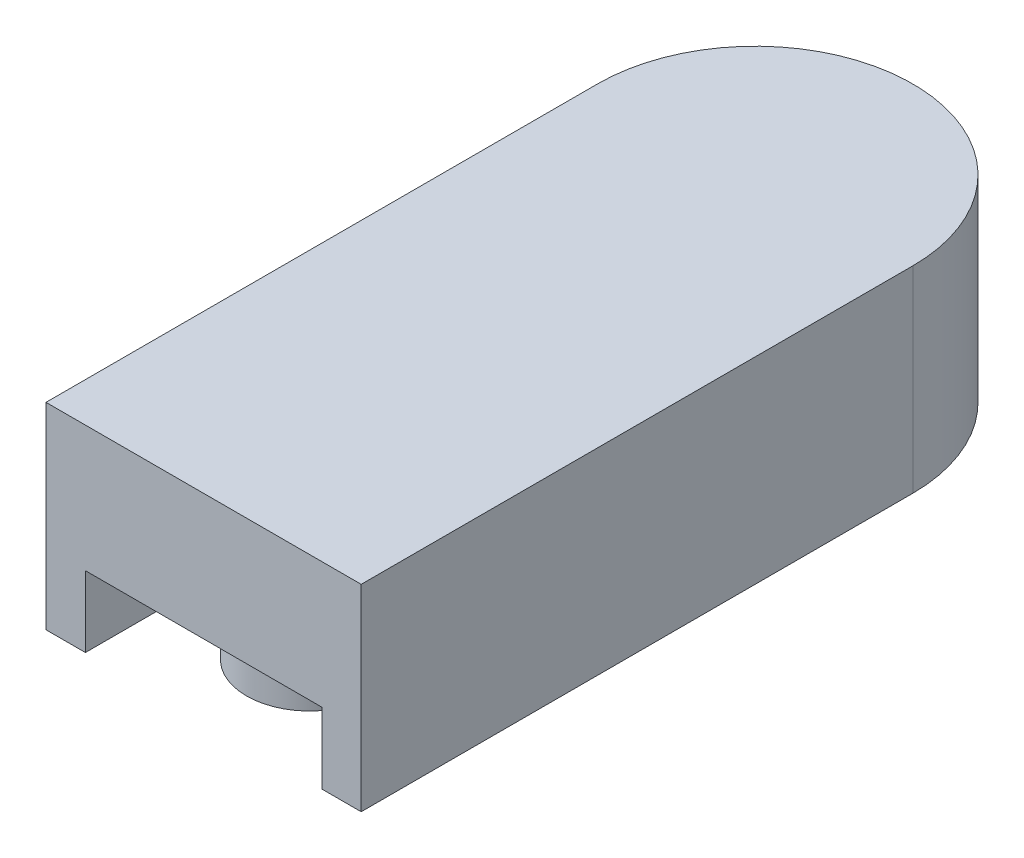
ISO-10303-21;
HEADER;
FILE_DESCRIPTION(('STEP AP214'),'2;1');
FILE_NAME('part.step','',(''),(''),'','','');
FILE_SCHEMA(('AUTOMOTIVE_DESIGN { 1 0 10303 214 1 1 1 1 }'));
ENDSEC;
DATA;
#1=APPLICATION_CONTEXT('core data for automotive mechanical design processes');
#2=APPLICATION_PROTOCOL_DEFINITION('international standard','automotive_design',2000,#1);
#3=PRODUCT_CONTEXT('',#1,'mechanical');
#4=PRODUCT('Part','Part','',(#3));
#5=PRODUCT_RELATED_PRODUCT_CATEGORY('part','',(#4));
#6=PRODUCT_DEFINITION_FORMATION('','',#4);
#7=PRODUCT_DEFINITION_CONTEXT('part definition',#1,'design');
#8=PRODUCT_DEFINITION('design','',#6,#7);
#9=PRODUCT_DEFINITION_SHAPE('','',#8);
#10=(LENGTH_UNIT() NAMED_UNIT(*) SI_UNIT(.MILLI.,.METRE.));
#11=(NAMED_UNIT(*) PLANE_ANGLE_UNIT() SI_UNIT($,.RADIAN.));
#12=(NAMED_UNIT(*) SI_UNIT($,.STERADIAN.) SOLID_ANGLE_UNIT());
#13=UNCERTAINTY_MEASURE_WITH_UNIT(LENGTH_MEASURE(1.E-05),#10,'distance_accuracy_value','');
#14=(GEOMETRIC_REPRESENTATION_CONTEXT(3) GLOBAL_UNCERTAINTY_ASSIGNED_CONTEXT((#13)) GLOBAL_UNIT_ASSIGNED_CONTEXT((#10,
#11,#12)) REPRESENTATION_CONTEXT('',''));
#15=CARTESIAN_POINT('',(0.,0.,0.));
#16=DIRECTION('',(0.,0.,1.));
#17=DIRECTION('',(1.,0.,0.));
#18=AXIS2_PLACEMENT_3D('',#15,#16,#17);
#19=CARTESIAN_POINT('',(0.,25.,22.5607936443925));
#20=DIRECTION('',(0.,0.,1.));
#21=DIRECTION('',(1.,0.,0.));
#22=AXIS2_PLACEMENT_3D('',#19,#20,#21);
#23=PLANE('',#22);
#24=DIRECTION('',(1.,0.,0.));
#25=VECTOR('',#24,1.);
#26=CARTESIAN_POINT('',(-12.6666532241803,9.,22.5607936443925));
#27=LINE('',#26,#25);
#28=CARTESIAN_POINT('',(-12.6666532241803,9.,22.5607936443925));
#29=VERTEX_POINT('',#28);
#30=CARTESIAN_POINT('',(17.3333467758197,9.,22.5607936443925));
#31=VERTEX_POINT('',#30);
#32=EDGE_CURVE('E122',#29,#31,#27,.T.);
#33=ORIENTED_EDGE('',*,*,#32,.T.);
#34=DIRECTION('',(0.,-1.,0.));
#35=VECTOR('',#34,1.);
#36=CARTESIAN_POINT('',(17.3333467758197,9.,22.5607936443925));
#37=LINE('',#36,#35);
#38=CARTESIAN_POINT('',(17.3333467758197,0.,22.5607936443925));
#39=VERTEX_POINT('',#38);
#40=EDGE_CURVE('E129',#31,#39,#37,.T.);
#41=ORIENTED_EDGE('',*,*,#40,.T.);
#42=DIRECTION('',(-1.,0.,0.));
#43=VECTOR('',#42,1.);
#44=CARTESIAN_POINT('',(0.,0.,22.5607936443925));
#45=LINE('',#44,#43);
#46=CARTESIAN_POINT('',(22.3333467758197,0.,22.5607936443925));
#47=VERTEX_POINT('',#46);
#48=EDGE_CURVE('E171',#47,#39,#45,.T.);
#49=ORIENTED_EDGE('',*,*,#48,.F.);
#50=DIRECTION('',(0.,-1.,0.));
#51=VECTOR('',#50,1.);
#52=CARTESIAN_POINT('',(22.3333467758197,25.,22.5607936443925));
#53=LINE('',#52,#51);
#54=CARTESIAN_POINT('',(22.3333467758197,25.,22.5607936443925));
#55=VERTEX_POINT('',#54);
#56=EDGE_CURVE('E70',#55,#47,#53,.T.);
#57=ORIENTED_EDGE('',*,*,#56,.F.);
#58=DIRECTION('',(-1.,0.,0.));
#59=VECTOR('',#58,1.);
#60=CARTESIAN_POINT('',(0.,25.,22.5607936443925));
#61=LINE('',#60,#59);
#62=CARTESIAN_POINT('',(-17.6666532241803,25.,22.5607936443925));
#63=VERTEX_POINT('',#62);
#64=EDGE_CURVE('E178',#55,#63,#61,.T.);
#65=ORIENTED_EDGE('',*,*,#64,.T.);
#66=DIRECTION('',(0.,-1.,0.));
#67=VECTOR('',#66,1.);
#68=CARTESIAN_POINT('',(-17.6666532241803,25.,22.5607936443925));
#69=LINE('',#68,#67);
#70=CARTESIAN_POINT('',(-17.6666532241803,0.,22.5607936443925));
#71=VERTEX_POINT('',#70);
#72=EDGE_CURVE('E196',#63,#71,#69,.T.);
#73=ORIENTED_EDGE('',*,*,#72,.T.);
#74=CARTESIAN_POINT('',(-12.6666532241803,0.,22.5607936443925));
#75=VERTEX_POINT('',#74);
#76=EDGE_CURVE('E191',#75,#71,#45,.T.);
#77=ORIENTED_EDGE('',*,*,#76,.F.);
#78=DIRECTION('',(0.,-1.,0.));
#79=VECTOR('',#78,1.);
#80=CARTESIAN_POINT('',(-12.6666532241803,9.,22.5607936443925));
#81=LINE('',#80,#79);
#82=EDGE_CURVE('E61',#29,#75,#81,.T.);
#83=ORIENTED_EDGE('',*,*,#82,.F.);
#84=EDGE_LOOP('',(#33,#41,#49,#57,#65,#73,#77,#83));
#85=FACE_BOUND('',#84,.T.);
#86=ADVANCED_FACE('F45',(#85),#23,.T.);
#87=CARTESIAN_POINT('',(22.3333467758197,25.,0.));
#88=DIRECTION('',(1.,0.,0.));
#89=DIRECTION('',(0.,0.,-1.));
#90=AXIS2_PLACEMENT_3D('',#87,#88,#89);
#91=PLANE('',#90);
#92=DIRECTION('',(0.,0.,1.));
#93=VECTOR('',#92,1.);
#94=CARTESIAN_POINT('',(22.3333467758197,0.,0.));
#95=LINE('',#94,#93);
#96=CARTESIAN_POINT('',(22.3333467758197,0.,-47.4392063556076));
#97=VERTEX_POINT('',#96);
#98=EDGE_CURVE('E135',#97,#47,#95,.T.);
#99=ORIENTED_EDGE('',*,*,#98,.F.);
#100=DIRECTION('',(0.,-1.,0.));
#101=VECTOR('',#100,1.);
#102=CARTESIAN_POINT('',(22.3333467758197,25.,-47.4392063556076));
#103=LINE('',#102,#101);
#104=CARTESIAN_POINT('',(22.3333467758197,25.,-47.4392063556076));
#105=VERTEX_POINT('',#104);
#106=EDGE_CURVE('E11',#105,#97,#103,.T.);
#107=ORIENTED_EDGE('',*,*,#106,.F.);
#108=DIRECTION('',(0.,0.,1.));
#109=VECTOR('',#108,1.);
#110=CARTESIAN_POINT('',(22.3333467758197,25.,0.));
#111=LINE('',#110,#109);
#112=EDGE_CURVE('E167',#105,#55,#111,.T.);
#113=ORIENTED_EDGE('',*,*,#112,.T.);
#114=ORIENTED_EDGE('',*,*,#56,.T.);
#115=EDGE_LOOP('',(#99,#107,#113,#114));
#116=FACE_BOUND('',#115,.T.);
#117=ADVANCED_FACE('F47',(#116),#91,.T.);
#118=CARTESIAN_POINT('',(2.33334677581966,25.,-47.4392063556076));
#119=DIRECTION('',(0.,-1.,0.));
#120=DIRECTION('',(0.,0.,-1.));
#121=AXIS2_PLACEMENT_3D('',#118,#119,#120);
#122=CYLINDRICAL_SURFACE('',#121,20.);
#123=CARTESIAN_POINT('',(2.33334677581966,0.,-47.4392063556076));
#124=DIRECTION('',(0.,1.,0.));
#125=DIRECTION('',(0.,0.,1.));
#126=AXIS2_PLACEMENT_3D('',#123,#124,#125);
#127=CIRCLE('',#126,20.);
#128=CARTESIAN_POINT('',(-17.6666532241803,0.,-47.4392063556076));
#129=VERTEX_POINT('',#128);
#130=EDGE_CURVE('E183',#97,#129,#127,.T.);
#131=ORIENTED_EDGE('',*,*,#130,.T.);
#132=DIRECTION('',(0.,-1.,0.));
#133=VECTOR('',#132,1.);
#134=CARTESIAN_POINT('',(-17.6666532241803,25.,-47.4392063556076));
#135=LINE('',#134,#133);
#136=CARTESIAN_POINT('',(-17.6666532241803,25.,-47.4392063556076));
#137=VERTEX_POINT('',#136);
#138=EDGE_CURVE('E54',#137,#129,#135,.T.);
#139=ORIENTED_EDGE('',*,*,#138,.F.);
#140=CARTESIAN_POINT('',(2.33334677581966,25.,-47.4392063556076));
#141=DIRECTION('',(0.,1.,0.));
#142=DIRECTION('',(0.,0.,1.));
#143=AXIS2_PLACEMENT_3D('',#140,#141,#142);
#144=CIRCLE('',#143,20.);
#145=EDGE_CURVE('E170',#105,#137,#144,.T.);
#146=ORIENTED_EDGE('',*,*,#145,.F.);
#147=ORIENTED_EDGE('',*,*,#106,.T.);
#148=EDGE_LOOP('',(#131,#139,#146,#147));
#149=FACE_BOUND('',#148,.T.);
#150=ADVANCED_FACE('F207',(#149),#122,.T.);
#151=CARTESIAN_POINT('',(-17.6666532241803,25.,0.));
#152=DIRECTION('',(-1.,0.,0.));
#153=DIRECTION('',(0.,0.,1.));
#154=AXIS2_PLACEMENT_3D('',#151,#152,#153);
#155=PLANE('',#154);
#156=DIRECTION('',(0.,0.,-1.));
#157=VECTOR('',#156,1.);
#158=CARTESIAN_POINT('',(-17.6666532241803,0.,0.));
#159=LINE('',#158,#157);
#160=EDGE_CURVE('E187',#71,#129,#159,.T.);
#161=ORIENTED_EDGE('',*,*,#160,.F.);
#162=ORIENTED_EDGE('',*,*,#72,.F.);
#163=DIRECTION('',(0.,0.,-1.));
#164=VECTOR('',#163,1.);
#165=CARTESIAN_POINT('',(-17.6666532241803,25.,0.));
#166=LINE('',#165,#164);
#167=EDGE_CURVE('E174',#63,#137,#166,.T.);
#168=ORIENTED_EDGE('',*,*,#167,.T.);
#169=ORIENTED_EDGE('',*,*,#138,.T.);
#170=EDGE_LOOP('',(#161,#162,#168,#169));
#171=FACE_BOUND('',#170,.T.);
#172=ADVANCED_FACE('F203',(#171),#155,.T.);
#173=CARTESIAN_POINT('',(0.,25.,0.));
#174=DIRECTION('',(0.,1.,0.));
#175=DIRECTION('',(0.,0.,1.));
#176=AXIS2_PLACEMENT_3D('',#173,#174,#175);
#177=PLANE('',#176);
#178=ORIENTED_EDGE('',*,*,#112,.F.);
#179=ORIENTED_EDGE('',*,*,#145,.T.);
#180=ORIENTED_EDGE('',*,*,#167,.F.);
#181=ORIENTED_EDGE('',*,*,#64,.F.);
#182=EDGE_LOOP('',(#178,#179,#180,#181));
#183=FACE_BOUND('',#182,.T.);
#184=ADVANCED_FACE('F214',(#183),#177,.T.);
#185=CARTESIAN_POINT('',(0.,0.,0.));
#186=DIRECTION('',(0.,1.,0.));
#187=DIRECTION('',(0.,0.,1.));
#188=AXIS2_PLACEMENT_3D('',#185,#186,#187);
#189=PLANE('',#188);
#190=DIRECTION('',(0.,0.,-1.));
#191=VECTOR('',#190,1.);
#192=CARTESIAN_POINT('',(17.3333467758197,0.,9.11047818298658));
#193=LINE('',#192,#191);
#194=CARTESIAN_POINT('',(17.3333467758197,0.,9.11047818298658));
#195=VERTEX_POINT('',#194);
#196=EDGE_CURVE('E132',#39,#195,#193,.T.);
#197=ORIENTED_EDGE('',*,*,#196,.T.);
#198=CARTESIAN_POINT('',(2.33334677581967,0.,9.11047818298658));
#199=DIRECTION('',(0.,1.,0.));
#200=DIRECTION('',(0.,0.,1.));
#201=AXIS2_PLACEMENT_3D('',#198,#199,#200);
#202=CIRCLE('',#201,15.);
#203=CARTESIAN_POINT('',(-12.6666532241803,0.,9.11047818298658));
#204=VERTEX_POINT('',#203);
#205=EDGE_CURVE('E143',#195,#204,#202,.T.);
#206=ORIENTED_EDGE('',*,*,#205,.T.);
#207=DIRECTION('',(0.,0.,1.));
#208=VECTOR('',#207,1.);
#209=CARTESIAN_POINT('',(-12.6666532241803,0.,22.5607936443925));
#210=LINE('',#209,#208);
#211=EDGE_CURVE('E140',#204,#75,#210,.T.);
#212=ORIENTED_EDGE('',*,*,#211,.T.);
#213=ORIENTED_EDGE('',*,*,#76,.T.);
#214=ORIENTED_EDGE('',*,*,#160,.T.);
#215=ORIENTED_EDGE('',*,*,#130,.F.);
#216=ORIENTED_EDGE('',*,*,#98,.T.);
#217=ORIENTED_EDGE('',*,*,#48,.T.);
#218=EDGE_LOOP('',(#197,#206,#212,#213,#214,#215,#216,#217));
#219=FACE_BOUND('',#218,.T.);
#220=ADVANCED_FACE('F209',(#219),#189,.F.);
#221=CARTESIAN_POINT('',(2.33334677581967,9.,9.11047818298658));
#222=DIRECTION('',(0.,1.,0.));
#223=DIRECTION('',(0.,0.,1.));
#224=AXIS2_PLACEMENT_3D('',#221,#222,#223);
#225=PLANE('',#224);
#226=ORIENTED_EDGE('',*,*,#32,.F.);
#227=DIRECTION('',(0.,0.,1.));
#228=VECTOR('',#227,1.);
#229=CARTESIAN_POINT('',(-12.6666532241803,9.,22.5607936443925));
#230=LINE('',#229,#228);
#231=CARTESIAN_POINT('',(-12.6666532241803,9.,9.11047818298658));
#232=VERTEX_POINT('',#231);
#233=EDGE_CURVE('E151',#232,#29,#230,.T.);
#234=ORIENTED_EDGE('',*,*,#233,.F.);
#235=CARTESIAN_POINT('',(2.33334677581967,9.,9.11047818298658));
#236=DIRECTION('',(0.,1.,0.));
#237=DIRECTION('',(0.,0.,1.));
#238=AXIS2_PLACEMENT_3D('',#235,#236,#237);
#239=CIRCLE('',#238,15.);
#240=CARTESIAN_POINT('',(17.3333467758197,9.,9.11047818298658));
#241=VERTEX_POINT('',#240);
#242=EDGE_CURVE('E123',#241,#232,#239,.T.);
#243=ORIENTED_EDGE('',*,*,#242,.F.);
#244=DIRECTION('',(0.,0.,-1.));
#245=VECTOR('',#244,1.);
#246=CARTESIAN_POINT('',(17.3333467758197,9.,9.11047818298658));
#247=LINE('',#246,#245);
#248=EDGE_CURVE('E116',#31,#241,#247,.T.);
#249=ORIENTED_EDGE('',*,*,#248,.F.);
#250=EDGE_LOOP('',(#226,#234,#243,#249));
#251=FACE_BOUND('',#250,.T.);
#252=CARTESIAN_POINT('',(2.33334677581967,9.,9.11047818298658));
#253=DIRECTION('',(0.,1.,0.));
#254=DIRECTION('',(0.,0.,1.));
#255=AXIS2_PLACEMENT_3D('',#252,#253,#254);
#256=CIRCLE('',#255,8.);
#257=CARTESIAN_POINT('',(2.33334677581967,9.,17.1104781829866));
#258=VERTEX_POINT('',#257);
#259=EDGE_CURVE('E156',#258,#258,#256,.T.);
#260=ORIENTED_EDGE('',*,*,#259,.T.);
#261=EDGE_LOOP('',(#260));
#262=FACE_BOUND('',#261,.T.);
#263=ADVANCED_FACE('F118',(#251,#262),#225,.F.);
#264=CARTESIAN_POINT('',(17.3333467758197,9.,9.11047818298658));
#265=DIRECTION('',(-1.,0.,0.));
#266=DIRECTION('',(0.,0.,1.));
#267=AXIS2_PLACEMENT_3D('',#264,#265,#266);
#268=PLANE('',#267);
#269=ORIENTED_EDGE('',*,*,#196,.F.);
#270=ORIENTED_EDGE('',*,*,#40,.F.);
#271=ORIENTED_EDGE('',*,*,#248,.T.);
#272=DIRECTION('',(0.,-1.,0.));
#273=VECTOR('',#272,1.);
#274=CARTESIAN_POINT('',(17.3333467758197,9.,9.11047818298658));
#275=LINE('',#274,#273);
#276=EDGE_CURVE('E136',#241,#195,#275,.T.);
#277=ORIENTED_EDGE('',*,*,#276,.T.);
#278=EDGE_LOOP('',(#269,#270,#271,#277));
#279=FACE_BOUND('',#278,.T.);
#280=ADVANCED_FACE('F130',(#279),#268,.T.);
#281=CARTESIAN_POINT('',(2.33334677581967,9.,9.11047818298658));
#282=DIRECTION('',(0.,-1.,0.));
#283=DIRECTION('',(0.,0.,-1.));
#284=AXIS2_PLACEMENT_3D('',#281,#282,#283);
#285=CYLINDRICAL_SURFACE('',#284,15.);
#286=ORIENTED_EDGE('',*,*,#205,.F.);
#287=ORIENTED_EDGE('',*,*,#276,.F.);
#288=ORIENTED_EDGE('',*,*,#242,.T.);
#289=DIRECTION('',(0.,-1.,0.));
#290=VECTOR('',#289,1.);
#291=CARTESIAN_POINT('',(-12.6666532241803,9.,9.11047818298658));
#292=LINE('',#291,#290);
#293=EDGE_CURVE('E162',#232,#204,#292,.T.);
#294=ORIENTED_EDGE('',*,*,#293,.T.);
#295=EDGE_LOOP('',(#286,#287,#288,#294));
#296=FACE_BOUND('',#295,.T.);
#297=ADVANCED_FACE('F237',(#296),#285,.F.);
#298=CARTESIAN_POINT('',(-12.6666532241803,9.,22.5607936443925));
#299=DIRECTION('',(1.,0.,0.));
#300=DIRECTION('',(0.,0.,-1.));
#301=AXIS2_PLACEMENT_3D('',#298,#299,#300);
#302=PLANE('',#301);
#303=ORIENTED_EDGE('',*,*,#211,.F.);
#304=ORIENTED_EDGE('',*,*,#293,.F.);
#305=ORIENTED_EDGE('',*,*,#233,.T.);
#306=ORIENTED_EDGE('',*,*,#82,.T.);
#307=EDGE_LOOP('',(#303,#304,#305,#306));
#308=FACE_BOUND('',#307,.T.);
#309=ADVANCED_FACE('F240',(#308),#302,.T.);
#310=CARTESIAN_POINT('',(2.33334677581967,9.,9.11047818298658));
#311=DIRECTION('',(0.,-1.,0.));
#312=DIRECTION('',(0.,0.,-1.));
#313=AXIS2_PLACEMENT_3D('',#310,#311,#312);
#314=CYLINDRICAL_SURFACE('',#313,8.);
#315=ORIENTED_EDGE('',*,*,#259,.F.);
#316=EDGE_LOOP('',(#315));
#317=FACE_BOUND('',#316,.T.);
#318=CARTESIAN_POINT('',(2.33334677581967,0.,9.11047818298658));
#319=DIRECTION('',(0.,1.,0.));
#320=DIRECTION('',(0.,0.,1.));
#321=AXIS2_PLACEMENT_3D('',#318,#319,#320);
#322=CIRCLE('',#321,8.);
#323=CARTESIAN_POINT('',(2.33334677581967,0.,17.1104781829866));
#324=VERTEX_POINT('',#323);
#325=EDGE_CURVE('E146',#324,#324,#322,.T.);
#326=ORIENTED_EDGE('',*,*,#325,.T.);
#327=EDGE_LOOP('',(#326));
#328=FACE_BOUND('',#327,.T.);
#329=ADVANCED_FACE('F244',(#317,#328),#314,.T.);
#330=ORIENTED_EDGE('',*,*,#325,.F.);
#331=EDGE_LOOP('',(#330));
#332=FACE_BOUND('',#331,.T.);
#333=ADVANCED_FACE('F233',(#332),#189,.F.);
#334=CLOSED_SHELL('',(#86,#117,#150,#172,#184,#220,#263,#280,#297,#309,#329,#333));
#335=MANIFOLD_SOLID_BREP('B2',#334);
#336=ADVANCED_BREP_SHAPE_REPRESENTATION('',(#18,#335),#14);
#337=SHAPE_DEFINITION_REPRESENTATION(#9,#336);
ENDSEC;
END-ISO-10303-21;
